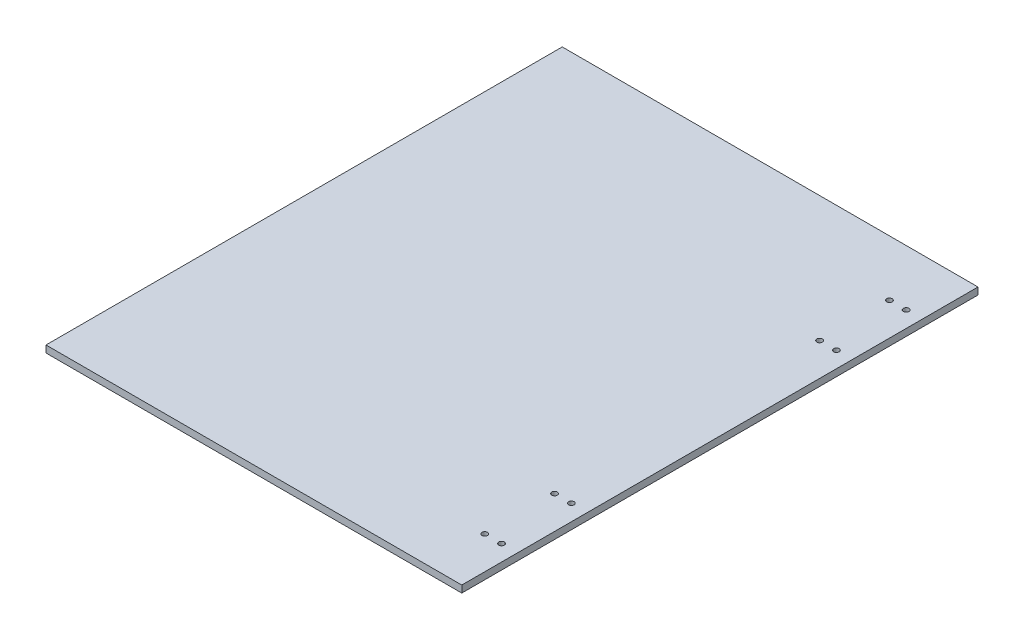
ISO-10303-21;
HEADER;
FILE_DESCRIPTION(('STEP AP214'),'2;1');
FILE_NAME('part.step','',(''),(''),'','','');
FILE_SCHEMA(('AUTOMOTIVE_DESIGN { 1 0 10303 214 1 1 1 1 }'));
ENDSEC;
DATA;
#1=APPLICATION_CONTEXT('core data for automotive mechanical design processes');
#2=APPLICATION_PROTOCOL_DEFINITION('international standard','automotive_design',2000,#1);
#3=PRODUCT_CONTEXT('',#1,'mechanical');
#4=PRODUCT('Part','Part','',(#3));
#5=PRODUCT_RELATED_PRODUCT_CATEGORY('part','',(#4));
#6=PRODUCT_DEFINITION_FORMATION('','',#4);
#7=PRODUCT_DEFINITION_CONTEXT('part definition',#1,'design');
#8=PRODUCT_DEFINITION('design','',#6,#7);
#9=PRODUCT_DEFINITION_SHAPE('','',#8);
#10=(LENGTH_UNIT() NAMED_UNIT(*) SI_UNIT(.MILLI.,.METRE.));
#11=(NAMED_UNIT(*) PLANE_ANGLE_UNIT() SI_UNIT($,.RADIAN.));
#12=(NAMED_UNIT(*) SI_UNIT($,.STERADIAN.) SOLID_ANGLE_UNIT());
#13=UNCERTAINTY_MEASURE_WITH_UNIT(LENGTH_MEASURE(1.E-05),#10,'distance_accuracy_value','');
#14=(GEOMETRIC_REPRESENTATION_CONTEXT(3) GLOBAL_UNCERTAINTY_ASSIGNED_CONTEXT((#13)) GLOBAL_UNIT_ASSIGNED_CONTEXT((#10,
#11,#12)) REPRESENTATION_CONTEXT('',''));
#15=CARTESIAN_POINT('',(0.,0.,0.));
#16=DIRECTION('',(0.,0.,1.));
#17=DIRECTION('',(1.,0.,0.));
#18=AXIS2_PLACEMENT_3D('',#15,#16,#17);
#19=CARTESIAN_POINT('',(-152.75,5.,-185.));
#20=DIRECTION('',(1.,0.,0.));
#21=DIRECTION('',(0.,0.,-1.));
#22=AXIS2_PLACEMENT_3D('',#19,#20,#21);
#23=PLANE('',#22);
#24=DIRECTION('',(0.,0.,1.));
#25=VECTOR('',#24,1.);
#26=CARTESIAN_POINT('',(-152.75,0.,-185.));
#27=LINE('',#26,#25);
#28=CARTESIAN_POINT('',(-152.75,0.,-185.));
#29=VERTEX_POINT('',#28);
#30=CARTESIAN_POINT('',(-152.75,0.,185.));
#31=VERTEX_POINT('',#30);
#32=EDGE_CURVE('E107',#29,#31,#27,.T.);
#33=ORIENTED_EDGE('',*,*,#32,.T.);
#34=DIRECTION('',(0.,-1.,0.));
#35=VECTOR('',#34,1.);
#36=CARTESIAN_POINT('',(-152.75,5.,185.));
#37=LINE('',#36,#35);
#38=CARTESIAN_POINT('',(-152.75,5.,185.));
#39=VERTEX_POINT('',#38);
#40=EDGE_CURVE('E11',#39,#31,#37,.T.);
#41=ORIENTED_EDGE('',*,*,#40,.F.);
#42=DIRECTION('',(0.,0.,1.));
#43=VECTOR('',#42,1.);
#44=CARTESIAN_POINT('',(-152.75,5.,-185.));
#45=LINE('',#44,#43);
#46=CARTESIAN_POINT('',(-152.75,5.,-185.));
#47=VERTEX_POINT('',#46);
#48=EDGE_CURVE('E91',#47,#39,#45,.T.);
#49=ORIENTED_EDGE('',*,*,#48,.F.);
#50=DIRECTION('',(0.,-1.,0.));
#51=VECTOR('',#50,1.);
#52=CARTESIAN_POINT('',(-152.75,5.,-185.));
#53=LINE('',#52,#51);
#54=EDGE_CURVE('E103',#47,#29,#53,.T.);
#55=ORIENTED_EDGE('',*,*,#54,.T.);
#56=EDGE_LOOP('',(#33,#41,#49,#55));
#57=FACE_BOUND('',#56,.T.);
#58=ADVANCED_FACE('F39',(#57),#23,.F.);
#59=CARTESIAN_POINT('',(-152.75,5.,185.));
#60=DIRECTION('',(0.,0.,-1.));
#61=DIRECTION('',(-1.,0.,0.));
#62=AXIS2_PLACEMENT_3D('',#59,#60,#61);
#63=PLANE('',#62);
#64=DIRECTION('',(1.,0.,0.));
#65=VECTOR('',#64,1.);
#66=CARTESIAN_POINT('',(-152.75,0.,185.));
#67=LINE('',#66,#65);
#68=CARTESIAN_POINT('',(145.25,0.,185.));
#69=VERTEX_POINT('',#68);
#70=EDGE_CURVE('E96',#31,#69,#67,.T.);
#71=ORIENTED_EDGE('',*,*,#70,.T.);
#72=DIRECTION('',(0.,-1.,0.));
#73=VECTOR('',#72,1.);
#74=CARTESIAN_POINT('',(145.25,5.,185.));
#75=LINE('',#74,#73);
#76=CARTESIAN_POINT('',(145.25,5.,185.));
#77=VERTEX_POINT('',#76);
#78=EDGE_CURVE('E48',#77,#69,#75,.T.);
#79=ORIENTED_EDGE('',*,*,#78,.F.);
#80=DIRECTION('',(1.,0.,0.));
#81=VECTOR('',#80,1.);
#82=CARTESIAN_POINT('',(-152.75,5.,185.));
#83=LINE('',#82,#81);
#84=EDGE_CURVE('E86',#39,#77,#83,.T.);
#85=ORIENTED_EDGE('',*,*,#84,.F.);
#86=ORIENTED_EDGE('',*,*,#40,.T.);
#87=EDGE_LOOP('',(#71,#79,#85,#86));
#88=FACE_BOUND('',#87,.T.);
#89=ADVANCED_FACE('F95',(#88),#63,.F.);
#90=CARTESIAN_POINT('',(145.25,5.,-185.));
#91=DIRECTION('',(-1.,0.,0.));
#92=DIRECTION('',(0.,0.,1.));
#93=AXIS2_PLACEMENT_3D('',#90,#91,#92);
#94=PLANE('',#93);
#95=DIRECTION('',(0.,0.,-1.));
#96=VECTOR('',#95,1.);
#97=CARTESIAN_POINT('',(145.25,0.,-185.));
#98=LINE('',#97,#96);
#99=CARTESIAN_POINT('',(145.25,0.,-185.));
#100=VERTEX_POINT('',#99);
#101=EDGE_CURVE('E73',#69,#100,#98,.T.);
#102=ORIENTED_EDGE('',*,*,#101,.T.);
#103=DIRECTION('',(0.,-1.,0.));
#104=VECTOR('',#103,1.);
#105=CARTESIAN_POINT('',(145.25,5.,-185.));
#106=LINE('',#105,#104);
#107=CARTESIAN_POINT('',(145.25,5.,-185.));
#108=VERTEX_POINT('',#107);
#109=EDGE_CURVE('E98',#108,#100,#106,.T.);
#110=ORIENTED_EDGE('',*,*,#109,.F.);
#111=DIRECTION('',(0.,0.,-1.));
#112=VECTOR('',#111,1.);
#113=CARTESIAN_POINT('',(145.25,5.,-185.));
#114=LINE('',#113,#112);
#115=EDGE_CURVE('E89',#77,#108,#114,.T.);
#116=ORIENTED_EDGE('',*,*,#115,.F.);
#117=ORIENTED_EDGE('',*,*,#78,.T.);
#118=EDGE_LOOP('',(#102,#110,#116,#117));
#119=FACE_BOUND('',#118,.T.);
#120=ADVANCED_FACE('F99',(#119),#94,.F.);
#121=CARTESIAN_POINT('',(-152.75,5.,-185.));
#122=DIRECTION('',(0.,0.,1.));
#123=DIRECTION('',(1.,0.,0.));
#124=AXIS2_PLACEMENT_3D('',#121,#122,#123);
#125=PLANE('',#124);
#126=DIRECTION('',(-1.,0.,0.));
#127=VECTOR('',#126,1.);
#128=CARTESIAN_POINT('',(-152.75,0.,-185.));
#129=LINE('',#128,#127);
#130=EDGE_CURVE('E79',#100,#29,#129,.T.);
#131=ORIENTED_EDGE('',*,*,#130,.T.);
#132=ORIENTED_EDGE('',*,*,#54,.F.);
#133=DIRECTION('',(-1.,0.,0.));
#134=VECTOR('',#133,1.);
#135=CARTESIAN_POINT('',(-152.75,5.,-185.));
#136=LINE('',#135,#134);
#137=EDGE_CURVE('E56',#108,#47,#136,.T.);
#138=ORIENTED_EDGE('',*,*,#137,.F.);
#139=ORIENTED_EDGE('',*,*,#109,.T.);
#140=EDGE_LOOP('',(#131,#132,#138,#139));
#141=FACE_BOUND('',#140,.T.);
#142=ADVANCED_FACE('F121',(#141),#125,.F.);
#143=CARTESIAN_POINT('',(0.,5.,0.));
#144=DIRECTION('',(0.,1.,0.));
#145=DIRECTION('',(0.,0.,1.));
#146=AXIS2_PLACEMENT_3D('',#143,#144,#145);
#147=PLANE('',#146);
#148=CARTESIAN_POINT('',(133.75,5.,94.9999999999999));
#149=DIRECTION('',(0.,1.,0.));
#150=DIRECTION('',(0.,0.,1.));
#151=AXIS2_PLACEMENT_3D('',#148,#149,#150);
#152=CIRCLE('',#151,2.);
#153=CARTESIAN_POINT('',(133.75,5.,96.9999999999999));
#154=VERTEX_POINT('',#153);
#155=EDGE_CURVE('E152',#154,#154,#152,.T.);
#156=ORIENTED_EDGE('',*,*,#155,.F.);
#157=EDGE_LOOP('',(#156));
#158=FACE_BOUND('',#157,.T.);
#159=CARTESIAN_POINT('',(133.75,5.,-95.));
#160=DIRECTION('',(0.,1.,0.));
#161=DIRECTION('',(0.,0.,1.));
#162=AXIS2_PLACEMENT_3D('',#159,#160,#161);
#163=CIRCLE('',#162,2.);
#164=CARTESIAN_POINT('',(133.75,5.,-93.));
#165=VERTEX_POINT('',#164);
#166=EDGE_CURVE('E161',#165,#165,#163,.T.);
#167=ORIENTED_EDGE('',*,*,#166,.F.);
#168=EDGE_LOOP('',(#167));
#169=FACE_BOUND('',#168,.T.);
#170=CARTESIAN_POINT('',(121.75,5.,-95.));
#171=DIRECTION('',(0.,1.,0.));
#172=DIRECTION('',(0.,0.,1.));
#173=AXIS2_PLACEMENT_3D('',#170,#171,#172);
#174=CIRCLE('',#173,2.);
#175=CARTESIAN_POINT('',(121.75,5.,-93.));
#176=VERTEX_POINT('',#175);
#177=EDGE_CURVE('E136',#176,#176,#174,.T.);
#178=ORIENTED_EDGE('',*,*,#177,.F.);
#179=EDGE_LOOP('',(#178));
#180=FACE_BOUND('',#179,.T.);
#181=CARTESIAN_POINT('',(133.75,5.,-145.));
#182=DIRECTION('',(0.,1.,0.));
#183=DIRECTION('',(0.,0.,1.));
#184=AXIS2_PLACEMENT_3D('',#181,#182,#183);
#185=CIRCLE('',#184,2.);
#186=CARTESIAN_POINT('',(133.75,5.,-143.));
#187=VERTEX_POINT('',#186);
#188=EDGE_CURVE('E145',#187,#187,#185,.T.);
#189=ORIENTED_EDGE('',*,*,#188,.F.);
#190=EDGE_LOOP('',(#189));
#191=FACE_BOUND('',#190,.T.);
#192=CARTESIAN_POINT('',(121.75,5.,145.));
#193=DIRECTION('',(0.,1.,0.));
#194=DIRECTION('',(0.,0.,1.));
#195=AXIS2_PLACEMENT_3D('',#192,#193,#194);
#196=CIRCLE('',#195,2.);
#197=CARTESIAN_POINT('',(121.75,5.,147.));
#198=VERTEX_POINT('',#197);
#199=EDGE_CURVE('E184',#198,#198,#196,.T.);
#200=ORIENTED_EDGE('',*,*,#199,.F.);
#201=EDGE_LOOP('',(#200));
#202=FACE_BOUND('',#201,.T.);
#203=CARTESIAN_POINT('',(133.75,5.,145.));
#204=DIRECTION('',(0.,1.,0.));
#205=DIRECTION('',(0.,0.,1.));
#206=AXIS2_PLACEMENT_3D('',#203,#204,#205);
#207=CIRCLE('',#206,2.);
#208=CARTESIAN_POINT('',(133.75,5.,147.));
#209=VERTEX_POINT('',#208);
#210=EDGE_CURVE('E168',#209,#209,#207,.T.);
#211=ORIENTED_EDGE('',*,*,#210,.F.);
#212=EDGE_LOOP('',(#211));
#213=FACE_BOUND('',#212,.T.);
#214=CARTESIAN_POINT('',(121.75,5.,94.9999999999999));
#215=DIRECTION('',(0.,1.,0.));
#216=DIRECTION('',(0.,0.,1.));
#217=AXIS2_PLACEMENT_3D('',#214,#215,#216);
#218=CIRCLE('',#217,1.99999999999995);
#219=CARTESIAN_POINT('',(121.75,5.,96.9999999999999));
#220=VERTEX_POINT('',#219);
#221=EDGE_CURVE('E177',#220,#220,#218,.T.);
#222=ORIENTED_EDGE('',*,*,#221,.F.);
#223=EDGE_LOOP('',(#222));
#224=FACE_BOUND('',#223,.T.);
#225=CARTESIAN_POINT('',(121.75,5.,-145.));
#226=DIRECTION('',(0.,1.,0.));
#227=DIRECTION('',(0.,0.,1.));
#228=AXIS2_PLACEMENT_3D('',#225,#226,#227);
#229=CIRCLE('',#228,1.99999999999998);
#230=CARTESIAN_POINT('',(121.75,5.,-143.));
#231=VERTEX_POINT('',#230);
#232=EDGE_CURVE('E128',#231,#231,#229,.T.);
#233=ORIENTED_EDGE('',*,*,#232,.F.);
#234=EDGE_LOOP('',(#233));
#235=FACE_BOUND('',#234,.T.);
#236=ORIENTED_EDGE('',*,*,#48,.T.);
#237=ORIENTED_EDGE('',*,*,#84,.T.);
#238=ORIENTED_EDGE('',*,*,#115,.T.);
#239=ORIENTED_EDGE('',*,*,#137,.T.);
#240=EDGE_LOOP('',(#236,#237,#238,#239));
#241=FACE_BOUND('',#240,.T.);
#242=ADVANCED_FACE('F87',(#158,#169,#180,#191,#202,#213,#224,#235,#241),#147,.T.);
#243=CARTESIAN_POINT('',(0.,0.,0.));
#244=DIRECTION('',(0.,1.,0.));
#245=DIRECTION('',(0.,0.,1.));
#246=AXIS2_PLACEMENT_3D('',#243,#244,#245);
#247=PLANE('',#246);
#248=CARTESIAN_POINT('',(133.75,0.,94.9999999999999));
#249=DIRECTION('',(0.,1.,0.));
#250=DIRECTION('',(0.,0.,1.));
#251=AXIS2_PLACEMENT_3D('',#248,#249,#250);
#252=CIRCLE('',#251,2.);
#253=CARTESIAN_POINT('',(133.75,0.,96.9999999999999));
#254=VERTEX_POINT('',#253);
#255=EDGE_CURVE('E156',#254,#254,#252,.T.);
#256=ORIENTED_EDGE('',*,*,#255,.T.);
#257=EDGE_LOOP('',(#256));
#258=FACE_BOUND('',#257,.T.);
#259=CARTESIAN_POINT('',(133.75,0.,-95.));
#260=DIRECTION('',(0.,1.,0.));
#261=DIRECTION('',(0.,0.,1.));
#262=AXIS2_PLACEMENT_3D('',#259,#260,#261);
#263=CIRCLE('',#262,2.);
#264=CARTESIAN_POINT('',(133.75,0.,-93.));
#265=VERTEX_POINT('',#264);
#266=EDGE_CURVE('E141',#265,#265,#263,.T.);
#267=ORIENTED_EDGE('',*,*,#266,.T.);
#268=EDGE_LOOP('',(#267));
#269=FACE_BOUND('',#268,.T.);
#270=CARTESIAN_POINT('',(121.75,0.,-95.));
#271=DIRECTION('',(0.,1.,0.));
#272=DIRECTION('',(0.,0.,1.));
#273=AXIS2_PLACEMENT_3D('',#270,#271,#272);
#274=CIRCLE('',#273,2.);
#275=CARTESIAN_POINT('',(121.75,0.,-93.));
#276=VERTEX_POINT('',#275);
#277=EDGE_CURVE('E140',#276,#276,#274,.T.);
#278=ORIENTED_EDGE('',*,*,#277,.T.);
#279=EDGE_LOOP('',(#278));
#280=FACE_BOUND('',#279,.T.);
#281=CARTESIAN_POINT('',(133.75,0.,-145.));
#282=DIRECTION('',(0.,1.,0.));
#283=DIRECTION('',(0.,0.,1.));
#284=AXIS2_PLACEMENT_3D('',#281,#282,#283);
#285=CIRCLE('',#284,2.);
#286=CARTESIAN_POINT('',(133.75,0.,-143.));
#287=VERTEX_POINT('',#286);
#288=EDGE_CURVE('E132',#287,#287,#285,.T.);
#289=ORIENTED_EDGE('',*,*,#288,.T.);
#290=EDGE_LOOP('',(#289));
#291=FACE_BOUND('',#290,.T.);
#292=CARTESIAN_POINT('',(121.75,0.,145.));
#293=DIRECTION('',(0.,1.,0.));
#294=DIRECTION('',(0.,0.,1.));
#295=AXIS2_PLACEMENT_3D('',#292,#293,#294);
#296=CIRCLE('',#295,2.);
#297=CARTESIAN_POINT('',(121.75,0.,147.));
#298=VERTEX_POINT('',#297);
#299=EDGE_CURVE('E173',#298,#298,#296,.T.);
#300=ORIENTED_EDGE('',*,*,#299,.T.);
#301=EDGE_LOOP('',(#300));
#302=FACE_BOUND('',#301,.T.);
#303=CARTESIAN_POINT('',(133.75,0.,145.));
#304=DIRECTION('',(0.,1.,0.));
#305=DIRECTION('',(0.,0.,1.));
#306=AXIS2_PLACEMENT_3D('',#303,#304,#305);
#307=CIRCLE('',#306,2.);
#308=CARTESIAN_POINT('',(133.75,0.,147.));
#309=VERTEX_POINT('',#308);
#310=EDGE_CURVE('E172',#309,#309,#307,.T.);
#311=ORIENTED_EDGE('',*,*,#310,.T.);
#312=EDGE_LOOP('',(#311));
#313=FACE_BOUND('',#312,.T.);
#314=CARTESIAN_POINT('',(121.75,0.,94.9999999999999));
#315=DIRECTION('',(0.,1.,0.));
#316=DIRECTION('',(0.,0.,1.));
#317=AXIS2_PLACEMENT_3D('',#314,#315,#316);
#318=CIRCLE('',#317,1.99999999999995);
#319=CARTESIAN_POINT('',(121.75,0.,96.9999999999999));
#320=VERTEX_POINT('',#319);
#321=EDGE_CURVE('E157',#320,#320,#318,.T.);
#322=ORIENTED_EDGE('',*,*,#321,.T.);
#323=EDGE_LOOP('',(#322));
#324=FACE_BOUND('',#323,.T.);
#325=CARTESIAN_POINT('',(121.75,0.,-145.));
#326=DIRECTION('',(0.,1.,0.));
#327=DIRECTION('',(0.,0.,1.));
#328=AXIS2_PLACEMENT_3D('',#325,#326,#327);
#329=CIRCLE('',#328,1.99999999999998);
#330=CARTESIAN_POINT('',(121.75,0.,-143.));
#331=VERTEX_POINT('',#330);
#332=EDGE_CURVE('E111',#331,#331,#329,.T.);
#333=ORIENTED_EDGE('',*,*,#332,.T.);
#334=EDGE_LOOP('',(#333));
#335=FACE_BOUND('',#334,.T.);
#336=ORIENTED_EDGE('',*,*,#32,.F.);
#337=ORIENTED_EDGE('',*,*,#130,.F.);
#338=ORIENTED_EDGE('',*,*,#101,.F.);
#339=ORIENTED_EDGE('',*,*,#70,.F.);
#340=EDGE_LOOP('',(#336,#337,#338,#339));
#341=FACE_BOUND('',#340,.T.);
#342=ADVANCED_FACE('F124',(#258,#269,#280,#291,#302,#313,#324,#335,#341),#247,.F.);
#343=CARTESIAN_POINT('',(121.75,0.,-145.));
#344=DIRECTION('',(0.,1.,0.));
#345=DIRECTION('',(0.,0.,1.));
#346=AXIS2_PLACEMENT_3D('',#343,#344,#345);
#347=CYLINDRICAL_SURFACE('',#346,1.99999999999998);
#348=ORIENTED_EDGE('',*,*,#332,.F.);
#349=EDGE_LOOP('',(#348));
#350=FACE_BOUND('',#349,.T.);
#351=ORIENTED_EDGE('',*,*,#232,.T.);
#352=EDGE_LOOP('',(#351));
#353=FACE_BOUND('',#352,.T.);
#354=ADVANCED_FACE('F212',(#350,#353),#347,.F.);
#355=CARTESIAN_POINT('',(121.75,0.,94.9999999999999));
#356=DIRECTION('',(0.,1.,0.));
#357=DIRECTION('',(0.,0.,1.));
#358=AXIS2_PLACEMENT_3D('',#355,#356,#357);
#359=CYLINDRICAL_SURFACE('',#358,1.99999999999995);
#360=ORIENTED_EDGE('',*,*,#321,.F.);
#361=EDGE_LOOP('',(#360));
#362=FACE_BOUND('',#361,.T.);
#363=ORIENTED_EDGE('',*,*,#221,.T.);
#364=EDGE_LOOP('',(#363));
#365=FACE_BOUND('',#364,.T.);
#366=ADVANCED_FACE('F214',(#362,#365),#359,.F.);
#367=CARTESIAN_POINT('',(133.75,0.,145.));
#368=DIRECTION('',(0.,1.,0.));
#369=DIRECTION('',(0.,0.,1.));
#370=AXIS2_PLACEMENT_3D('',#367,#368,#369);
#371=CYLINDRICAL_SURFACE('',#370,2.);
#372=ORIENTED_EDGE('',*,*,#310,.F.);
#373=EDGE_LOOP('',(#372));
#374=FACE_BOUND('',#373,.T.);
#375=ORIENTED_EDGE('',*,*,#210,.T.);
#376=EDGE_LOOP('',(#375));
#377=FACE_BOUND('',#376,.T.);
#378=ADVANCED_FACE('F198',(#374,#377),#371,.F.);
#379=CARTESIAN_POINT('',(121.75,0.,145.));
#380=DIRECTION('',(0.,1.,0.));
#381=DIRECTION('',(0.,0.,1.));
#382=AXIS2_PLACEMENT_3D('',#379,#380,#381);
#383=CYLINDRICAL_SURFACE('',#382,2.);
#384=ORIENTED_EDGE('',*,*,#299,.F.);
#385=EDGE_LOOP('',(#384));
#386=FACE_BOUND('',#385,.T.);
#387=ORIENTED_EDGE('',*,*,#199,.T.);
#388=EDGE_LOOP('',(#387));
#389=FACE_BOUND('',#388,.T.);
#390=ADVANCED_FACE('F194',(#386,#389),#383,.F.);
#391=CARTESIAN_POINT('',(133.75,0.,-145.));
#392=DIRECTION('',(0.,1.,0.));
#393=DIRECTION('',(0.,0.,1.));
#394=AXIS2_PLACEMENT_3D('',#391,#392,#393);
#395=CYLINDRICAL_SURFACE('',#394,2.);
#396=ORIENTED_EDGE('',*,*,#288,.F.);
#397=EDGE_LOOP('',(#396));
#398=FACE_BOUND('',#397,.T.);
#399=ORIENTED_EDGE('',*,*,#188,.T.);
#400=EDGE_LOOP('',(#399));
#401=FACE_BOUND('',#400,.T.);
#402=ADVANCED_FACE('F197',(#398,#401),#395,.F.);
#403=CARTESIAN_POINT('',(121.75,0.,-95.));
#404=DIRECTION('',(0.,1.,0.));
#405=DIRECTION('',(0.,0.,1.));
#406=AXIS2_PLACEMENT_3D('',#403,#404,#405);
#407=CYLINDRICAL_SURFACE('',#406,2.);
#408=ORIENTED_EDGE('',*,*,#277,.F.);
#409=EDGE_LOOP('',(#408));
#410=FACE_BOUND('',#409,.T.);
#411=ORIENTED_EDGE('',*,*,#177,.T.);
#412=EDGE_LOOP('',(#411));
#413=FACE_BOUND('',#412,.T.);
#414=ADVANCED_FACE('F283',(#410,#413),#407,.F.);
#415=CARTESIAN_POINT('',(133.75,0.,-95.));
#416=DIRECTION('',(0.,1.,0.));
#417=DIRECTION('',(0.,0.,1.));
#418=AXIS2_PLACEMENT_3D('',#415,#416,#417);
#419=CYLINDRICAL_SURFACE('',#418,2.);
#420=ORIENTED_EDGE('',*,*,#266,.F.);
#421=EDGE_LOOP('',(#420));
#422=FACE_BOUND('',#421,.T.);
#423=ORIENTED_EDGE('',*,*,#166,.T.);
#424=EDGE_LOOP('',(#423));
#425=FACE_BOUND('',#424,.T.);
#426=ADVANCED_FACE('F293',(#422,#425),#419,.F.);
#427=CARTESIAN_POINT('',(133.75,0.,94.9999999999999));
#428=DIRECTION('',(0.,1.,0.));
#429=DIRECTION('',(0.,0.,1.));
#430=AXIS2_PLACEMENT_3D('',#427,#428,#429);
#431=CYLINDRICAL_SURFACE('',#430,2.);
#432=ORIENTED_EDGE('',*,*,#255,.F.);
#433=EDGE_LOOP('',(#432));
#434=FACE_BOUND('',#433,.T.);
#435=ORIENTED_EDGE('',*,*,#155,.T.);
#436=EDGE_LOOP('',(#435));
#437=FACE_BOUND('',#436,.T.);
#438=ADVANCED_FACE('F302',(#434,#437),#431,.F.);
#439=CLOSED_SHELL('',(#58,#89,#120,#142,#242,#342,#354,#366,#378,#390,#402,#414,#426,#438));
#440=MANIFOLD_SOLID_BREP('B2',#439);
#441=ADVANCED_BREP_SHAPE_REPRESENTATION('',(#18,#440),#14);
#442=SHAPE_DEFINITION_REPRESENTATION(#9,#441);
ENDSEC;
END-ISO-10303-21;
